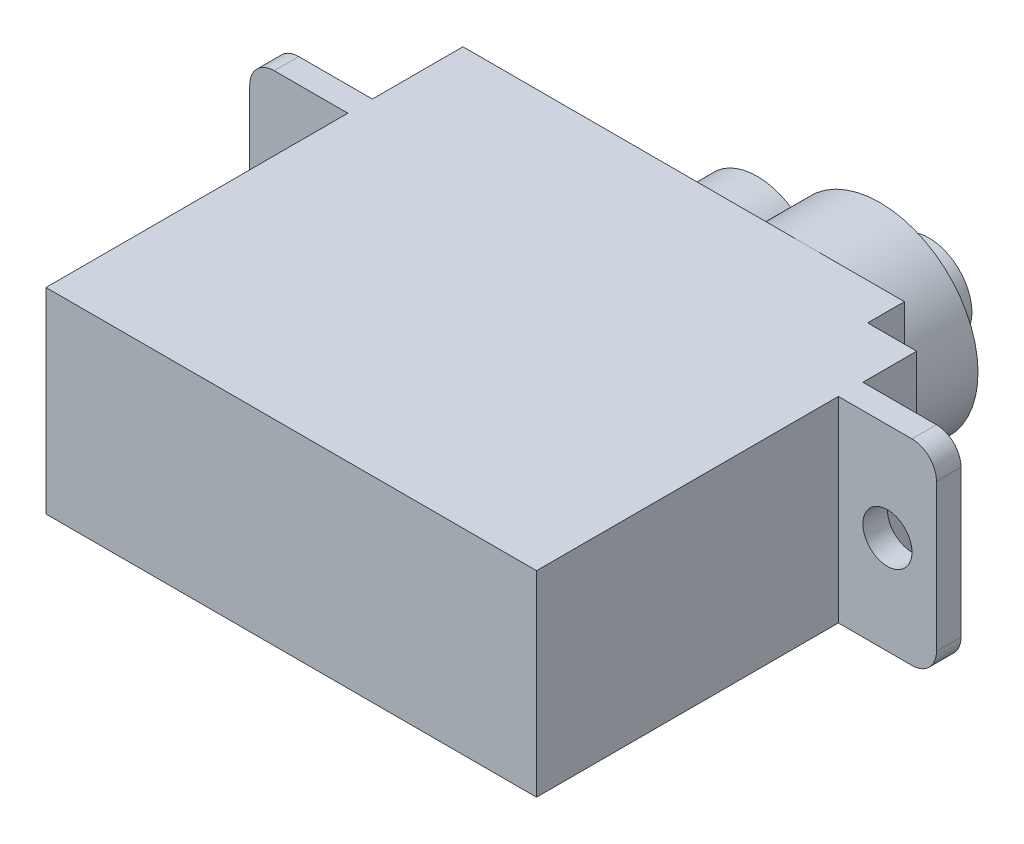
ISO-10303-21;
HEADER;
FILE_DESCRIPTION(('STEP AP214'),'2;1');
FILE_NAME('part.step','',(''),(''),'','','');
FILE_SCHEMA(('AUTOMOTIVE_DESIGN { 1 0 10303 214 1 1 1 1 }'));
ENDSEC;
DATA;
#1=APPLICATION_CONTEXT('core data for automotive mechanical design processes');
#2=APPLICATION_PROTOCOL_DEFINITION('international standard','automotive_design',2000,#1);
#3=PRODUCT_CONTEXT('',#1,'mechanical');
#4=PRODUCT('Part','Part','',(#3));
#5=PRODUCT_RELATED_PRODUCT_CATEGORY('part','',(#4));
#6=PRODUCT_DEFINITION_FORMATION('','',#4);
#7=PRODUCT_DEFINITION_CONTEXT('part definition',#1,'design');
#8=PRODUCT_DEFINITION('design','',#6,#7);
#9=PRODUCT_DEFINITION_SHAPE('','',#8);
#10=(LENGTH_UNIT() NAMED_UNIT(*) SI_UNIT(.MILLI.,.METRE.));
#11=(NAMED_UNIT(*) PLANE_ANGLE_UNIT() SI_UNIT($,.RADIAN.));
#12=(NAMED_UNIT(*) SI_UNIT($,.STERADIAN.) SOLID_ANGLE_UNIT());
#13=UNCERTAINTY_MEASURE_WITH_UNIT(LENGTH_MEASURE(1.E-05),#10,'distance_accuracy_value','');
#14=(GEOMETRIC_REPRESENTATION_CONTEXT(3) GLOBAL_UNCERTAINTY_ASSIGNED_CONTEXT((#13)) GLOBAL_UNIT_ASSIGNED_CONTEXT((#10,
#11,#12)) REPRESENTATION_CONTEXT('',''));
#15=CARTESIAN_POINT('',(0.,0.,0.));
#16=DIRECTION('',(0.,0.,1.));
#17=DIRECTION('',(1.,0.,0.));
#18=AXIS2_PLACEMENT_3D('',#15,#16,#17);
#19=CARTESIAN_POINT('',(5.95121951219512,4.,-8.801393728223));
#20=DIRECTION('',(0.,0.,1.));
#21=DIRECTION('',(1.,0.,0.));
#22=AXIS2_PLACEMENT_3D('',#19,#20,#21);
#23=CYLINDRICAL_SURFACE('',#22,4.);
#24=DIRECTION('',(0.,0.,1.));
#25=VECTOR('',#24,1.);
#26=CARTESIAN_POINT('',(2.50581216751059,1.96796451084291,-7.301393728223));
#27=LINE('',#26,#25);
#28=CARTESIAN_POINT('',(2.50581216751059,1.96796451084291,-8.801393728223));
#29=VERTEX_POINT('',#28);
#30=CARTESIAN_POINT('',(2.50581216751059,1.96796451084291,-5.801393728223));
#31=VERTEX_POINT('',#30);
#32=EDGE_CURVE('E229',#29,#31,#27,.T.);
#33=ORIENTED_EDGE('',*,*,#32,.F.);
#34=CARTESIAN_POINT('',(5.95121951219512,4.,-8.801393728223));
#35=DIRECTION('',(0.,0.,-1.));
#36=DIRECTION('',(-1.,0.,0.));
#37=AXIS2_PLACEMENT_3D('',#34,#35,#36);
#38=CIRCLE('',#37,4.);
#39=CARTESIAN_POINT('',(2.44705584221105,5.92894711538803,-8.801393728223));
#40=VERTEX_POINT('',#39);
#41=EDGE_CURVE('E240',#40,#29,#38,.T.);
#42=ORIENTED_EDGE('',*,*,#41,.F.);
#43=DIRECTION('',(0.,0.,1.));
#44=VECTOR('',#43,1.);
#45=CARTESIAN_POINT('',(2.44705584221105,5.92894711538803,-7.301393728223));
#46=LINE('',#45,#44);
#47=CARTESIAN_POINT('',(2.44705584221105,5.92894711538803,-5.801393728223));
#48=VERTEX_POINT('',#47);
#49=EDGE_CURVE('E232',#48,#40,#46,.F.);
#50=ORIENTED_EDGE('',*,*,#49,.F.);
#51=CARTESIAN_POINT('',(5.95121951219512,4.,-5.801393728223));
#52=DIRECTION('',(0.,0.,-1.));
#53=DIRECTION('',(-1.,0.,0.));
#54=AXIS2_PLACEMENT_3D('',#51,#52,#53);
#55=CIRCLE('',#54,4.);
#56=CARTESIAN_POINT('',(5.95121951219512,8.,-5.801393728223));
#57=VERTEX_POINT('',#56);
#58=EDGE_CURVE('E253',#48,#57,#55,.T.);
#59=ORIENTED_EDGE('',*,*,#58,.T.);
#60=CARTESIAN_POINT('',(9.95121951219512,4.,-5.801393728223));
#61=VERTEX_POINT('',#60);
#62=EDGE_CURVE('E243',#57,#61,#55,.T.);
#63=ORIENTED_EDGE('',*,*,#62,.T.);
#64=CARTESIAN_POINT('',(5.95121951219512,0.,-5.801393728223));
#65=VERTEX_POINT('',#64);
#66=EDGE_CURVE('E357',#61,#65,#55,.T.);
#67=ORIENTED_EDGE('',*,*,#66,.T.);
#68=EDGE_CURVE('E242',#65,#31,#55,.T.);
#69=ORIENTED_EDGE('',*,*,#68,.T.);
#70=EDGE_LOOP('',(#33,#42,#50,#59,#63,#67,#69));
#71=FACE_BOUND('',#70,.T.);
#72=ADVANCED_FACE('F78',(#71),#23,.T.);
#73=CARTESIAN_POINT('',(0.,8.,-5.801393728223));
#74=DIRECTION('',(0.,0.,1.));
#75=DIRECTION('',(1.,0.,0.));
#76=AXIS2_PLACEMENT_3D('',#73,#74,#75);
#77=PLANE('',#76);
#78=ORIENTED_EDGE('',*,*,#62,.F.);
#79=DIRECTION('',(-1.,0.,0.));
#80=VECTOR('',#79,1.);
#81=CARTESIAN_POINT('',(0.,8.,-5.801393728223));
#82=LINE('',#81,#80);
#83=CARTESIAN_POINT('',(9.95121951219512,8.,-5.801393728223));
#84=VERTEX_POINT('',#83);
#85=EDGE_CURVE('E261',#84,#57,#82,.T.);
#86=ORIENTED_EDGE('',*,*,#85,.F.);
#87=DIRECTION('',(0.,-1.,0.));
#88=VECTOR('',#87,1.);
#89=CARTESIAN_POINT('',(9.95121951219512,8.,-5.801393728223));
#90=LINE('',#89,#88);
#91=EDGE_CURVE('E330',#84,#61,#90,.T.);
#92=ORIENTED_EDGE('',*,*,#91,.T.);
#93=EDGE_LOOP('',(#78,#86,#92));
#94=FACE_BOUND('',#93,.T.);
#95=ADVANCED_FACE('F408',(#94),#77,.F.);
#96=ORIENTED_EDGE('',*,*,#66,.F.);
#97=CARTESIAN_POINT('',(9.95121951219512,0.,-5.801393728223));
#98=VERTEX_POINT('',#97);
#99=EDGE_CURVE('E329',#61,#98,#90,.T.);
#100=ORIENTED_EDGE('',*,*,#99,.T.);
#101=DIRECTION('',(-1.,0.,0.));
#102=VECTOR('',#101,1.);
#103=CARTESIAN_POINT('',(0.,0.,-5.801393728223));
#104=LINE('',#103,#102);
#105=EDGE_CURVE('E287',#98,#65,#104,.T.);
#106=ORIENTED_EDGE('',*,*,#105,.T.);
#107=EDGE_LOOP('',(#96,#100,#106));
#108=FACE_BOUND('',#107,.T.);
#109=ADVANCED_FACE('F413',(#108),#77,.F.);
#110=CARTESIAN_POINT('',(0.,8.,-4.301393728223));
#111=DIRECTION('',(0.,0.,1.));
#112=DIRECTION('',(1.,0.,0.));
#113=AXIS2_PLACEMENT_3D('',#110,#111,#112);
#114=PLANE('',#113);
#115=DIRECTION('',(-1.,0.,0.));
#116=VECTOR('',#115,1.);
#117=CARTESIAN_POINT('',(0.,0.,-4.301393728223));
#118=LINE('',#117,#116);
#119=CARTESIAN_POINT('',(11.9512195121951,0.,-4.301393728223));
#120=VERTEX_POINT('',#119);
#121=CARTESIAN_POINT('',(9.95121951219512,0.,-4.301393728223));
#122=VERTEX_POINT('',#121);
#123=EDGE_CURVE('E260',#120,#122,#118,.T.);
#124=ORIENTED_EDGE('',*,*,#123,.T.);
#125=DIRECTION('',(0.,-1.,0.));
#126=VECTOR('',#125,1.);
#127=CARTESIAN_POINT('',(9.95121951219512,8.,-4.301393728223));
#128=LINE('',#127,#126);
#129=CARTESIAN_POINT('',(9.95121951219512,8.,-4.301393728223));
#130=VERTEX_POINT('',#129);
#131=EDGE_CURVE('E281',#130,#122,#128,.T.);
#132=ORIENTED_EDGE('',*,*,#131,.F.);
#133=DIRECTION('',(-1.,0.,0.));
#134=VECTOR('',#133,1.);
#135=CARTESIAN_POINT('',(0.,8.,-4.301393728223));
#136=LINE('',#135,#134);
#137=CARTESIAN_POINT('',(11.9512195121951,8.,-4.301393728223));
#138=VERTEX_POINT('',#137);
#139=EDGE_CURVE('E279',#138,#130,#136,.T.);
#140=ORIENTED_EDGE('',*,*,#139,.F.);
#141=DIRECTION('',(0.,-1.,0.));
#142=VECTOR('',#141,1.);
#143=CARTESIAN_POINT('',(11.9512195121951,8.,-4.301393728223));
#144=LINE('',#143,#142);
#145=EDGE_CURVE('E308',#138,#120,#144,.T.);
#146=ORIENTED_EDGE('',*,*,#145,.T.);
#147=EDGE_LOOP('',(#124,#132,#140,#146));
#148=FACE_BOUND('',#147,.T.);
#149=ADVANCED_FACE('F428',(#148),#114,.F.);
#150=CARTESIAN_POINT('',(11.9512195121951,8.,0.));
#151=DIRECTION('',(-1.,0.,0.));
#152=DIRECTION('',(0.,0.,1.));
#153=AXIS2_PLACEMENT_3D('',#150,#151,#152);
#154=PLANE('',#153);
#155=DIRECTION('',(0.,0.,-1.));
#156=VECTOR('',#155,1.);
#157=CARTESIAN_POINT('',(11.9512195121951,0.,0.));
#158=LINE('',#157,#156);
#159=CARTESIAN_POINT('',(11.9512195121951,0.,-2.10801393728223));
#160=VERTEX_POINT('',#159);
#161=EDGE_CURVE('E300',#160,#120,#158,.T.);
#162=ORIENTED_EDGE('',*,*,#161,.T.);
#163=ORIENTED_EDGE('',*,*,#145,.F.);
#164=DIRECTION('',(0.,0.,-1.));
#165=VECTOR('',#164,1.);
#166=CARTESIAN_POINT('',(11.9512195121951,8.,0.));
#167=LINE('',#166,#165);
#168=CARTESIAN_POINT('',(11.9512195121951,8.,-2.10801393728223));
#169=VERTEX_POINT('',#168);
#170=EDGE_CURVE('E274',#169,#138,#167,.T.);
#171=ORIENTED_EDGE('',*,*,#170,.F.);
#172=DIRECTION('',(0.,-1.,0.));
#173=VECTOR('',#172,1.);
#174=CARTESIAN_POINT('',(11.9512195121951,8.,-2.10801393728223));
#175=LINE('',#174,#173);
#176=EDGE_CURVE('E311',#169,#160,#175,.T.);
#177=ORIENTED_EDGE('',*,*,#176,.T.);
#178=EDGE_LOOP('',(#162,#163,#171,#177));
#179=FACE_BOUND('',#178,.T.);
#180=ADVANCED_FACE('F431',(#179),#154,.F.);
#181=CARTESIAN_POINT('',(0.,8.,-2.10801393728222));
#182=DIRECTION('',(0.,0.,-1.));
#183=DIRECTION('',(-1.,0.,0.));
#184=AXIS2_PLACEMENT_3D('',#181,#182,#183);
#185=PLANE('',#184);
#186=CARTESIAN_POINT('',(13.9512195121951,4.,-2.10801393728223));
#187=DIRECTION('',(0.,0.,-1.));
#188=DIRECTION('',(-1.,0.,0.));
#189=AXIS2_PLACEMENT_3D('',#186,#187,#188);
#190=CIRCLE('',#189,1.);
#191=CARTESIAN_POINT('',(12.9512195121951,4.,-2.10801393728223));
#192=VERTEX_POINT('',#191);
#193=EDGE_CURVE('E530',#192,#192,#190,.T.);
#194=ORIENTED_EDGE('',*,*,#193,.F.);
#195=EDGE_LOOP('',(#194));
#196=FACE_BOUND('',#195,.T.);
#197=DIRECTION('',(0.,-1.,0.));
#198=VECTOR('',#197,1.);
#199=CARTESIAN_POINT('',(15.9512195121951,8.,-2.10801393728223));
#200=LINE('',#199,#198);
#201=CARTESIAN_POINT('',(15.9512195121951,7.,-2.10801393728223));
#202=VERTEX_POINT('',#201);
#203=CARTESIAN_POINT('',(15.9512195121951,1.,-2.10801393728223));
#204=VERTEX_POINT('',#203);
#205=EDGE_CURVE('E313',#202,#204,#200,.T.);
#206=ORIENTED_EDGE('',*,*,#205,.T.);
#207=CARTESIAN_POINT('',(14.9512195121951,1.,-2.10801393728223));
#208=DIRECTION('',(0.,0.,-1.));
#209=DIRECTION('',(-1.,0.,0.));
#210=AXIS2_PLACEMENT_3D('',#207,#208,#209);
#211=CIRCLE('',#210,1.);
#212=CARTESIAN_POINT('',(14.9512195121951,0.,-2.10801393728223));
#213=VERTEX_POINT('',#212);
#214=EDGE_CURVE('E82',#204,#213,#211,.T.);
#215=ORIENTED_EDGE('',*,*,#214,.T.);
#216=DIRECTION('',(1.,0.,0.));
#217=VECTOR('',#216,1.);
#218=CARTESIAN_POINT('',(0.,0.,-2.10801393728222));
#219=LINE('',#218,#217);
#220=EDGE_CURVE('E302',#160,#213,#219,.T.);
#221=ORIENTED_EDGE('',*,*,#220,.F.);
#222=ORIENTED_EDGE('',*,*,#176,.F.);
#223=DIRECTION('',(1.,0.,0.));
#224=VECTOR('',#223,1.);
#225=CARTESIAN_POINT('',(0.,8.,-2.10801393728222));
#226=LINE('',#225,#224);
#227=CARTESIAN_POINT('',(14.9512195121951,8.,-2.10801393728223));
#228=VERTEX_POINT('',#227);
#229=EDGE_CURVE('E276',#169,#228,#226,.T.);
#230=ORIENTED_EDGE('',*,*,#229,.T.);
#231=CARTESIAN_POINT('',(14.9512195121951,7.,-2.10801393728223));
#232=DIRECTION('',(0.,0.,-1.));
#233=DIRECTION('',(-1.,0.,0.));
#234=AXIS2_PLACEMENT_3D('',#231,#232,#233);
#235=CIRCLE('',#234,1.);
#236=EDGE_CURVE('E361',#228,#202,#235,.T.);
#237=ORIENTED_EDGE('',*,*,#236,.T.);
#238=EDGE_LOOP('',(#206,#215,#221,#222,#230,#237));
#239=FACE_BOUND('',#238,.T.);
#240=ADVANCED_FACE('F387',(#196,#239),#185,.T.);
#241=CARTESIAN_POINT('',(15.9512195121951,8.,0.));
#242=DIRECTION('',(1.,0.,0.));
#243=DIRECTION('',(0.,0.,-1.));
#244=AXIS2_PLACEMENT_3D('',#241,#242,#243);
#245=PLANE('',#244);
#246=DIRECTION('',(0.,-1.,0.));
#247=VECTOR('',#246,1.);
#248=CARTESIAN_POINT('',(15.9512195121951,8.,-1.10801393728223));
#249=LINE('',#248,#247);
#250=CARTESIAN_POINT('',(15.9512195121951,7.,-1.10801393728223));
#251=VERTEX_POINT('',#250);
#252=CARTESIAN_POINT('',(15.9512195121951,1.,-1.10801393728223));
#253=VERTEX_POINT('',#252);
#254=EDGE_CURVE('E315',#251,#253,#249,.T.);
#255=ORIENTED_EDGE('',*,*,#254,.T.);
#256=DIRECTION('',(0.,0.,1.));
#257=VECTOR('',#256,1.);
#258=CARTESIAN_POINT('',(15.9512195121951,1.,-2.10801393728223));
#259=LINE('',#258,#257);
#260=EDGE_CURVE('E94',#253,#204,#259,.F.);
#261=ORIENTED_EDGE('',*,*,#260,.T.);
#262=ORIENTED_EDGE('',*,*,#205,.F.);
#263=DIRECTION('',(0.,0.,1.));
#264=VECTOR('',#263,1.);
#265=CARTESIAN_POINT('',(15.9512195121951,7.,0.));
#266=LINE('',#265,#264);
#267=EDGE_CURVE('E353',#202,#251,#266,.T.);
#268=ORIENTED_EDGE('',*,*,#267,.T.);
#269=EDGE_LOOP('',(#255,#261,#262,#268));
#270=FACE_BOUND('',#269,.T.);
#271=ADVANCED_FACE('F439',(#270),#245,.T.);
#272=CARTESIAN_POINT('',(0.,8.,-1.10801393728223));
#273=DIRECTION('',(0.,0.,1.));
#274=DIRECTION('',(1.,0.,0.));
#275=AXIS2_PLACEMENT_3D('',#272,#273,#274);
#276=PLANE('',#275);
#277=CARTESIAN_POINT('',(13.9512195121951,4.,-1.10801393728223));
#278=DIRECTION('',(0.,0.,1.));
#279=DIRECTION('',(1.,0.,0.));
#280=AXIS2_PLACEMENT_3D('',#277,#278,#279);
#281=CIRCLE('',#280,1.);
#282=CARTESIAN_POINT('',(14.9512195121951,4.,-1.10801393728223));
#283=VERTEX_POINT('',#282);
#284=EDGE_CURVE('E349',#283,#283,#281,.T.);
#285=ORIENTED_EDGE('',*,*,#284,.F.);
#286=EDGE_LOOP('',(#285));
#287=FACE_BOUND('',#286,.T.);
#288=DIRECTION('',(-1.,0.,0.));
#289=VECTOR('',#288,1.);
#290=CARTESIAN_POINT('',(0.,0.,-1.10801393728223));
#291=LINE('',#290,#289);
#292=CARTESIAN_POINT('',(14.9512195121951,0.,-1.10801393728223));
#293=VERTEX_POINT('',#292);
#294=CARTESIAN_POINT('',(11.9512195121951,0.,-1.10801393728223));
#295=VERTEX_POINT('',#294);
#296=EDGE_CURVE('E299',#293,#295,#291,.T.);
#297=ORIENTED_EDGE('',*,*,#296,.F.);
#298=CARTESIAN_POINT('',(14.9512195121951,1.,-1.10801393728223));
#299=DIRECTION('',(0.,0.,1.));
#300=DIRECTION('',(1.,0.,0.));
#301=AXIS2_PLACEMENT_3D('',#298,#299,#300);
#302=CIRCLE('',#301,1.);
#303=EDGE_CURVE('E102',#293,#253,#302,.T.);
#304=ORIENTED_EDGE('',*,*,#303,.T.);
#305=ORIENTED_EDGE('',*,*,#254,.F.);
#306=CARTESIAN_POINT('',(14.9512195121951,7.,-1.10801393728223));
#307=DIRECTION('',(0.,0.,1.));
#308=DIRECTION('',(1.,0.,0.));
#309=AXIS2_PLACEMENT_3D('',#306,#307,#308);
#310=CIRCLE('',#309,1.);
#311=CARTESIAN_POINT('',(14.9512195121951,8.,-1.10801393728223));
#312=VERTEX_POINT('',#311);
#313=EDGE_CURVE('E356',#251,#312,#310,.T.);
#314=ORIENTED_EDGE('',*,*,#313,.T.);
#315=DIRECTION('',(-1.,0.,0.));
#316=VECTOR('',#315,1.);
#317=CARTESIAN_POINT('',(0.,8.,-1.10801393728223));
#318=LINE('',#317,#316);
#319=CARTESIAN_POINT('',(11.9512195121951,8.,-1.10801393728223));
#320=VERTEX_POINT('',#319);
#321=EDGE_CURVE('E273',#312,#320,#318,.T.);
#322=ORIENTED_EDGE('',*,*,#321,.T.);
#323=DIRECTION('',(0.,-1.,0.));
#324=VECTOR('',#323,1.);
#325=CARTESIAN_POINT('',(11.9512195121951,8.,-1.10801393728223));
#326=LINE('',#325,#324);
#327=EDGE_CURVE('E317',#320,#295,#326,.T.);
#328=ORIENTED_EDGE('',*,*,#327,.T.);
#329=EDGE_LOOP('',(#297,#304,#305,#314,#322,#328));
#330=FACE_BOUND('',#329,.T.);
#331=ADVANCED_FACE('F443',(#287,#330),#276,.T.);
#332=CARTESIAN_POINT('',(11.9512195121951,0.,11.198606271777));
#333=VERTEX_POINT('',#332);
#334=EDGE_CURVE('E296',#333,#295,#158,.T.);
#335=ORIENTED_EDGE('',*,*,#334,.T.);
#336=ORIENTED_EDGE('',*,*,#327,.F.);
#337=CARTESIAN_POINT('',(11.9512195121951,8.,11.198606271777));
#338=VERTEX_POINT('',#337);
#339=EDGE_CURVE('E270',#338,#320,#167,.T.);
#340=ORIENTED_EDGE('',*,*,#339,.F.);
#341=DIRECTION('',(0.,-1.,0.));
#342=VECTOR('',#341,1.);
#343=CARTESIAN_POINT('',(11.9512195121951,8.,11.198606271777));
#344=LINE('',#343,#342);
#345=EDGE_CURVE('E320',#338,#333,#344,.T.);
#346=ORIENTED_EDGE('',*,*,#345,.T.);
#347=EDGE_LOOP('',(#335,#336,#340,#346));
#348=FACE_BOUND('',#347,.T.);
#349=ADVANCED_FACE('F436',(#348),#154,.F.);
#350=CARTESIAN_POINT('',(9.95121951219512,8.,0.));
#351=DIRECTION('',(-1.,0.,0.));
#352=DIRECTION('',(0.,0.,1.));
#353=AXIS2_PLACEMENT_3D('',#350,#351,#352);
#354=PLANE('',#353);
#355=DIRECTION('',(0.,0.,-1.));
#356=VECTOR('',#355,1.);
#357=CARTESIAN_POINT('',(9.95121951219512,0.,0.));
#358=LINE('',#357,#356);
#359=EDGE_CURVE('E282',#122,#98,#358,.T.);
#360=ORIENTED_EDGE('',*,*,#359,.T.);
#361=ORIENTED_EDGE('',*,*,#99,.F.);
#362=ORIENTED_EDGE('',*,*,#91,.F.);
#363=DIRECTION('',(0.,0.,-1.));
#364=VECTOR('',#363,1.);
#365=CARTESIAN_POINT('',(9.95121951219512,8.,0.));
#366=LINE('',#365,#364);
#367=EDGE_CURVE('E256',#130,#84,#366,.T.);
#368=ORIENTED_EDGE('',*,*,#367,.F.);
#369=ORIENTED_EDGE('',*,*,#131,.T.);
#370=EDGE_LOOP('',(#360,#361,#362,#368,#369));
#371=FACE_BOUND('',#370,.T.);
#372=ADVANCED_FACE('F455',(#371),#354,.F.);
#373=CARTESIAN_POINT('',(0.951219512195122,3.92583112428704,-5.801393728223));
#374=DIRECTION('',(0.,0.,-1.));
#375=DIRECTION('',(-1.,0.,0.));
#376=AXIS2_PLACEMENT_3D('',#373,#374,#375);
#377=CIRCLE('',#376,2.5);
#378=EDGE_CURVE('E236',#31,#48,#377,.T.);
#379=ORIENTED_EDGE('',*,*,#378,.F.);
#380=ORIENTED_EDGE('',*,*,#68,.F.);
#381=CARTESIAN_POINT('',(-8.04878048780488,0.,-5.801393728223));
#382=VERTEX_POINT('',#381);
#383=EDGE_CURVE('E285',#65,#382,#104,.T.);
#384=ORIENTED_EDGE('',*,*,#383,.T.);
#385=DIRECTION('',(0.,-1.,0.));
#386=VECTOR('',#385,1.);
#387=CARTESIAN_POINT('',(-8.04878048780488,8.,-5.801393728223));
#388=LINE('',#387,#386);
#389=CARTESIAN_POINT('',(-8.04878048780488,8.,-5.801393728223));
#390=VERTEX_POINT('',#389);
#391=EDGE_CURVE('E326',#390,#382,#388,.T.);
#392=ORIENTED_EDGE('',*,*,#391,.F.);
#393=EDGE_CURVE('E259',#57,#390,#82,.T.);
#394=ORIENTED_EDGE('',*,*,#393,.F.);
#395=ORIENTED_EDGE('',*,*,#58,.F.);
#396=EDGE_LOOP('',(#379,#380,#384,#392,#394,#395));
#397=FACE_BOUND('',#396,.T.);
#398=ADVANCED_FACE('F416',(#397),#77,.F.);
#399=CARTESIAN_POINT('',(0.,8.,11.198606271777));
#400=DIRECTION('',(0.,0.,-1.));
#401=DIRECTION('',(-1.,0.,0.));
#402=AXIS2_PLACEMENT_3D('',#399,#400,#401);
#403=PLANE('',#402);
#404=DIRECTION('',(1.,0.,0.));
#405=VECTOR('',#404,1.);
#406=CARTESIAN_POINT('',(0.,0.,11.198606271777));
#407=LINE('',#406,#405);
#408=CARTESIAN_POINT('',(-8.04878048780488,0.,11.198606271777));
#409=VERTEX_POINT('',#408);
#410=EDGE_CURVE('E294',#409,#333,#407,.T.);
#411=ORIENTED_EDGE('',*,*,#410,.T.);
#412=ORIENTED_EDGE('',*,*,#345,.F.);
#413=DIRECTION('',(1.,0.,0.));
#414=VECTOR('',#413,1.);
#415=CARTESIAN_POINT('',(0.,8.,11.198606271777));
#416=LINE('',#415,#414);
#417=CARTESIAN_POINT('',(-8.04878048780488,8.,11.198606271777));
#418=VERTEX_POINT('',#417);
#419=EDGE_CURVE('E268',#418,#338,#416,.T.);
#420=ORIENTED_EDGE('',*,*,#419,.F.);
#421=DIRECTION('',(0.,-1.,0.));
#422=VECTOR('',#421,1.);
#423=CARTESIAN_POINT('',(-8.04878048780488,8.,11.198606271777));
#424=LINE('',#423,#422);
#425=EDGE_CURVE('E323',#418,#409,#424,.T.);
#426=ORIENTED_EDGE('',*,*,#425,.T.);
#427=EDGE_LOOP('',(#411,#412,#420,#426));
#428=FACE_BOUND('',#427,.T.);
#429=ADVANCED_FACE('F427',(#428),#403,.F.);
#430=CARTESIAN_POINT('',(0.,0.,0.));
#431=DIRECTION('',(0.,1.,0.));
#432=DIRECTION('',(0.,0.,1.));
#433=AXIS2_PLACEMENT_3D('',#430,#431,#432);
#434=PLANE('',#433);
#435=DIRECTION('',(1.,0.,0.));
#436=VECTOR('',#435,1.);
#437=CARTESIAN_POINT('',(-12.0487804878049,0.,-1.10801393728223));
#438=LINE('',#437,#436);
#439=CARTESIAN_POINT('',(-11.0487804878049,0.,-1.10801393728223));
#440=VERTEX_POINT('',#439);
#441=CARTESIAN_POINT('',(-8.04878048780488,0.,-1.10801393728223));
#442=VERTEX_POINT('',#441);
#443=EDGE_CURVE('E249',#440,#442,#438,.T.);
#444=ORIENTED_EDGE('',*,*,#443,.F.);
#445=DIRECTION('',(0.,0.,1.));
#446=VECTOR('',#445,1.);
#447=CARTESIAN_POINT('',(-11.0487804878049,0.,0.));
#448=LINE('',#447,#446);
#449=CARTESIAN_POINT('',(-11.0487804878049,0.,-2.10801393728223));
#450=VERTEX_POINT('',#449);
#451=EDGE_CURVE('E375',#440,#450,#448,.F.);
#452=ORIENTED_EDGE('',*,*,#451,.T.);
#453=DIRECTION('',(-1.,0.,0.));
#454=VECTOR('',#453,1.);
#455=CARTESIAN_POINT('',(-8.04878048780488,0.,-2.10801393728223));
#456=LINE('',#455,#454);
#457=CARTESIAN_POINT('',(-8.04878048780488,0.,-2.10801393728223));
#458=VERTEX_POINT('',#457);
#459=EDGE_CURVE('E246',#458,#450,#456,.T.);
#460=ORIENTED_EDGE('',*,*,#459,.F.);
#461=DIRECTION('',(0.,0.,1.));
#462=VECTOR('',#461,1.);
#463=CARTESIAN_POINT('',(-8.04878048780488,0.,0.));
#464=LINE('',#463,#462);
#465=EDGE_CURVE('E291',#382,#458,#464,.T.);
#466=ORIENTED_EDGE('',*,*,#465,.F.);
#467=ORIENTED_EDGE('',*,*,#383,.F.);
#468=ORIENTED_EDGE('',*,*,#105,.F.);
#469=ORIENTED_EDGE('',*,*,#359,.F.);
#470=ORIENTED_EDGE('',*,*,#123,.F.);
#471=ORIENTED_EDGE('',*,*,#161,.F.);
#472=ORIENTED_EDGE('',*,*,#220,.T.);
#473=DIRECTION('',(0.,0.,1.));
#474=VECTOR('',#473,1.);
#475=CARTESIAN_POINT('',(14.9512195121951,0.,-1.10801393728223));
#476=LINE('',#475,#474);
#477=EDGE_CURVE('E372',#213,#293,#476,.T.);
#478=ORIENTED_EDGE('',*,*,#477,.T.);
#479=ORIENTED_EDGE('',*,*,#296,.T.);
#480=ORIENTED_EDGE('',*,*,#334,.F.);
#481=ORIENTED_EDGE('',*,*,#410,.F.);
#482=EDGE_CURVE('E290',#442,#409,#464,.T.);
#483=ORIENTED_EDGE('',*,*,#482,.F.);
#484=EDGE_LOOP('',(#444,#452,#460,#466,#467,#468,#469,#470,#471,#472,#478,#479,#480,#481,#483));
#485=FACE_BOUND('',#484,.T.);
#486=ADVANCED_FACE('F393',(#485),#434,.F.);
#487=CARTESIAN_POINT('',(0.,8.,0.));
#488=DIRECTION('',(0.,1.,0.));
#489=DIRECTION('',(0.,0.,1.));
#490=AXIS2_PLACEMENT_3D('',#487,#488,#489);
#491=PLANE('',#490);
#492=DIRECTION('',(-1.,0.,0.));
#493=VECTOR('',#492,1.);
#494=CARTESIAN_POINT('',(-8.04878048780488,8.,-2.10801393728223));
#495=LINE('',#494,#493);
#496=CARTESIAN_POINT('',(-8.04878048780488,8.,-2.10801393728223));
#497=VERTEX_POINT('',#496);
#498=CARTESIAN_POINT('',(-11.0487804878049,8.,-2.10801393728223));
#499=VERTEX_POINT('',#498);
#500=EDGE_CURVE('E334',#497,#499,#495,.T.);
#501=ORIENTED_EDGE('',*,*,#500,.T.);
#502=DIRECTION('',(0.,0.,1.));
#503=VECTOR('',#502,1.);
#504=CARTESIAN_POINT('',(-11.0487804878049,8.,-1.10801393728223));
#505=LINE('',#504,#503);
#506=CARTESIAN_POINT('',(-11.0487804878049,8.,-1.10801393728223));
#507=VERTEX_POINT('',#506);
#508=EDGE_CURVE('E381',#499,#507,#505,.T.);
#509=ORIENTED_EDGE('',*,*,#508,.T.);
#510=DIRECTION('',(1.,0.,0.));
#511=VECTOR('',#510,1.);
#512=CARTESIAN_POINT('',(-12.0487804878049,8.,-1.10801393728223));
#513=LINE('',#512,#511);
#514=CARTESIAN_POINT('',(-8.04878048780488,8.,-1.10801393728223));
#515=VERTEX_POINT('',#514);
#516=EDGE_CURVE('E337',#507,#515,#513,.T.);
#517=ORIENTED_EDGE('',*,*,#516,.T.);
#518=DIRECTION('',(0.,0.,1.));
#519=VECTOR('',#518,1.);
#520=CARTESIAN_POINT('',(-8.04878048780488,8.,0.));
#521=LINE('',#520,#519);
#522=EDGE_CURVE('E264',#515,#418,#521,.T.);
#523=ORIENTED_EDGE('',*,*,#522,.T.);
#524=ORIENTED_EDGE('',*,*,#419,.T.);
#525=ORIENTED_EDGE('',*,*,#339,.T.);
#526=ORIENTED_EDGE('',*,*,#321,.F.);
#527=DIRECTION('',(0.,0.,1.));
#528=VECTOR('',#527,1.);
#529=CARTESIAN_POINT('',(14.9512195121951,8.,0.));
#530=LINE('',#529,#528);
#531=EDGE_CURVE('E359',#312,#228,#530,.F.);
#532=ORIENTED_EDGE('',*,*,#531,.T.);
#533=ORIENTED_EDGE('',*,*,#229,.F.);
#534=ORIENTED_EDGE('',*,*,#170,.T.);
#535=ORIENTED_EDGE('',*,*,#139,.T.);
#536=ORIENTED_EDGE('',*,*,#367,.T.);
#537=ORIENTED_EDGE('',*,*,#85,.T.);
#538=ORIENTED_EDGE('',*,*,#393,.T.);
#539=EDGE_CURVE('E265',#390,#497,#521,.T.);
#540=ORIENTED_EDGE('',*,*,#539,.T.);
#541=EDGE_LOOP('',(#501,#509,#517,#523,#524,#525,#526,#532,#533,#534,#535,#536,#537,#538,#540));
#542=FACE_BOUND('',#541,.T.);
#543=ADVANCED_FACE('F420',(#542),#491,.T.);
#544=CARTESIAN_POINT('',(-8.04878048780488,8.,0.));
#545=DIRECTION('',(1.,0.,0.));
#546=DIRECTION('',(0.,0.,-1.));
#547=AXIS2_PLACEMENT_3D('',#544,#545,#546);
#548=PLANE('',#547);
#549=ORIENTED_EDGE('',*,*,#522,.F.);
#550=DIRECTION('',(0.,-1.,0.));
#551=VECTOR('',#550,1.);
#552=CARTESIAN_POINT('',(-8.04878048780488,8.,-1.10801393728223));
#553=LINE('',#552,#551);
#554=EDGE_CURVE('E333',#515,#442,#553,.T.);
#555=ORIENTED_EDGE('',*,*,#554,.T.);
#556=ORIENTED_EDGE('',*,*,#482,.T.);
#557=ORIENTED_EDGE('',*,*,#425,.F.);
#558=EDGE_LOOP('',(#549,#555,#556,#557));
#559=FACE_BOUND('',#558,.T.);
#560=ADVANCED_FACE('F423',(#559),#548,.F.);
#561=DIRECTION('',(0.,-1.,0.));
#562=VECTOR('',#561,1.);
#563=CARTESIAN_POINT('',(-8.04878048780488,8.,-2.10801393728223));
#564=LINE('',#563,#562);
#565=EDGE_CURVE('E343',#497,#458,#564,.T.);
#566=ORIENTED_EDGE('',*,*,#565,.F.);
#567=ORIENTED_EDGE('',*,*,#539,.F.);
#568=ORIENTED_EDGE('',*,*,#391,.T.);
#569=ORIENTED_EDGE('',*,*,#465,.T.);
#570=EDGE_LOOP('',(#566,#567,#568,#569));
#571=FACE_BOUND('',#570,.T.);
#572=ADVANCED_FACE('F451',(#571),#548,.F.);
#573=CARTESIAN_POINT('',(-12.0487804878049,8.,-2.10801393728223));
#574=DIRECTION('',(1.,0.,0.));
#575=DIRECTION('',(0.,0.,-1.));
#576=AXIS2_PLACEMENT_3D('',#573,#574,#575);
#577=PLANE('',#576);
#578=DIRECTION('',(0.,-1.,0.));
#579=VECTOR('',#578,1.);
#580=CARTESIAN_POINT('',(-12.0487804878049,8.,-2.10801393728223));
#581=LINE('',#580,#579);
#582=CARTESIAN_POINT('',(-12.0487804878049,7.,-2.10801393728223));
#583=VERTEX_POINT('',#582);
#584=CARTESIAN_POINT('',(-12.0487804878049,1.,-2.10801393728223));
#585=VERTEX_POINT('',#584);
#586=EDGE_CURVE('E286',#583,#585,#581,.T.);
#587=ORIENTED_EDGE('',*,*,#586,.T.);
#588=DIRECTION('',(0.,0.,1.));
#589=VECTOR('',#588,1.);
#590=CARTESIAN_POINT('',(-12.0487804878049,1.,-2.10801393728223));
#591=LINE('',#590,#589);
#592=CARTESIAN_POINT('',(-12.0487804878049,1.,-1.10801393728223));
#593=VERTEX_POINT('',#592);
#594=EDGE_CURVE('E365',#585,#593,#591,.T.);
#595=ORIENTED_EDGE('',*,*,#594,.T.);
#596=DIRECTION('',(0.,-1.,0.));
#597=VECTOR('',#596,1.);
#598=CARTESIAN_POINT('',(-12.0487804878049,8.,-1.10801393728223));
#599=LINE('',#598,#597);
#600=CARTESIAN_POINT('',(-12.0487804878049,7.,-1.10801393728223));
#601=VERTEX_POINT('',#600);
#602=EDGE_CURVE('E338',#601,#593,#599,.T.);
#603=ORIENTED_EDGE('',*,*,#602,.F.);
#604=DIRECTION('',(0.,0.,1.));
#605=VECTOR('',#604,1.);
#606=CARTESIAN_POINT('',(-12.0487804878049,7.,-2.10801393728223));
#607=LINE('',#606,#605);
#608=EDGE_CURVE('E363',#601,#583,#607,.F.);
#609=ORIENTED_EDGE('',*,*,#608,.T.);
#610=EDGE_LOOP('',(#587,#595,#603,#609));
#611=FACE_BOUND('',#610,.T.);
#612=ADVANCED_FACE('F464',(#611),#577,.F.);
#613=CARTESIAN_POINT('',(-12.0487804878049,8.,-1.10801393728223));
#614=DIRECTION('',(0.,0.,-1.));
#615=DIRECTION('',(-1.,0.,0.));
#616=AXIS2_PLACEMENT_3D('',#613,#614,#615);
#617=PLANE('',#616);
#618=CARTESIAN_POINT('',(-10.0487804878049,4.,-1.10801393728223));
#619=DIRECTION('',(0.,0.,-1.));
#620=DIRECTION('',(-1.,0.,0.));
#621=AXIS2_PLACEMENT_3D('',#618,#619,#620);
#622=CIRCLE('',#621,1.);
#623=CARTESIAN_POINT('',(-11.0487804878049,4.,-1.10801393728223));
#624=VERTEX_POINT('',#623);
#625=EDGE_CURVE('E352',#624,#624,#622,.T.);
#626=ORIENTED_EDGE('',*,*,#625,.T.);
#627=EDGE_LOOP('',(#626));
#628=FACE_BOUND('',#627,.T.);
#629=ORIENTED_EDGE('',*,*,#602,.T.);
#630=CARTESIAN_POINT('',(-11.0487804878049,1.,-1.10801393728223));
#631=DIRECTION('',(0.,0.,-1.));
#632=DIRECTION('',(-1.,0.,0.));
#633=AXIS2_PLACEMENT_3D('',#630,#631,#632);
#634=CIRCLE('',#633,1.);
#635=EDGE_CURVE('E370',#593,#440,#634,.F.);
#636=ORIENTED_EDGE('',*,*,#635,.T.);
#637=ORIENTED_EDGE('',*,*,#443,.T.);
#638=ORIENTED_EDGE('',*,*,#554,.F.);
#639=ORIENTED_EDGE('',*,*,#516,.F.);
#640=CARTESIAN_POINT('',(-11.0487804878049,7.,-1.10801393728223));
#641=DIRECTION('',(0.,0.,-1.));
#642=DIRECTION('',(-1.,0.,0.));
#643=AXIS2_PLACEMENT_3D('',#640,#641,#642);
#644=CIRCLE('',#643,1.);
#645=EDGE_CURVE('E368',#507,#601,#644,.F.);
#646=ORIENTED_EDGE('',*,*,#645,.T.);
#647=EDGE_LOOP('',(#629,#636,#637,#638,#639,#646));
#648=FACE_BOUND('',#647,.T.);
#649=ADVANCED_FACE('F460',(#628,#648),#617,.F.);
#650=CARTESIAN_POINT('',(-8.04878048780488,8.,-2.10801393728223));
#651=DIRECTION('',(0.,0.,1.));
#652=DIRECTION('',(1.,0.,0.));
#653=AXIS2_PLACEMENT_3D('',#650,#651,#652);
#654=PLANE('',#653);
#655=CARTESIAN_POINT('',(-10.0487804878049,4.,-2.10801393728222));
#656=DIRECTION('',(0.,0.,-1.));
#657=DIRECTION('',(-1.,0.,0.));
#658=AXIS2_PLACEMENT_3D('',#655,#656,#657);
#659=CIRCLE('',#658,1.);
#660=CARTESIAN_POINT('',(-11.0487804878049,4.,-2.10801393728221));
#661=VERTEX_POINT('',#660);
#662=EDGE_CURVE('E531',#661,#661,#659,.T.);
#663=ORIENTED_EDGE('',*,*,#662,.F.);
#664=EDGE_LOOP('',(#663));
#665=FACE_BOUND('',#664,.T.);
#666=ORIENTED_EDGE('',*,*,#459,.T.);
#667=CARTESIAN_POINT('',(-11.0487804878049,1.,-2.10801393728223));
#668=DIRECTION('',(0.,0.,1.));
#669=DIRECTION('',(1.,0.,0.));
#670=AXIS2_PLACEMENT_3D('',#667,#668,#669);
#671=CIRCLE('',#670,1.);
#672=EDGE_CURVE('E379',#450,#585,#671,.F.);
#673=ORIENTED_EDGE('',*,*,#672,.T.);
#674=ORIENTED_EDGE('',*,*,#586,.F.);
#675=CARTESIAN_POINT('',(-11.0487804878049,7.,-2.10801393728223));
#676=DIRECTION('',(0.,0.,1.));
#677=DIRECTION('',(1.,0.,0.));
#678=AXIS2_PLACEMENT_3D('',#675,#676,#677);
#679=CIRCLE('',#678,1.);
#680=EDGE_CURVE('E377',#583,#499,#679,.F.);
#681=ORIENTED_EDGE('',*,*,#680,.T.);
#682=ORIENTED_EDGE('',*,*,#500,.F.);
#683=ORIENTED_EDGE('',*,*,#565,.T.);
#684=EDGE_LOOP('',(#666,#673,#674,#681,#682,#683));
#685=FACE_BOUND('',#684,.T.);
#686=ADVANCED_FACE('F463',(#665,#685),#654,.F.);
#687=CARTESIAN_POINT('',(5.95121951219512,4.,-8.801393728223));
#688=DIRECTION('',(0.,0.,-1.));
#689=DIRECTION('',(-1.,0.,0.));
#690=AXIS2_PLACEMENT_3D('',#687,#688,#689);
#691=PLANE('',#690);
#692=CARTESIAN_POINT('',(5.95121951219512,4.,-8.801393728223));
#693=DIRECTION('',(0.,0.,-1.));
#694=DIRECTION('',(-1.,0.,0.));
#695=AXIS2_PLACEMENT_3D('',#692,#693,#694);
#696=CIRCLE('',#695,1.75);
#697=CARTESIAN_POINT('',(4.20121951219512,4.,-8.801393728223));
#698=VERTEX_POINT('',#697);
#699=EDGE_CURVE('E12',#698,#698,#696,.T.);
#700=ORIENTED_EDGE('',*,*,#699,.F.);
#701=EDGE_LOOP('',(#700));
#702=FACE_BOUND('',#701,.T.);
#703=ORIENTED_EDGE('',*,*,#41,.T.);
#704=CARTESIAN_POINT('',(0.951219512195121,3.92583112428704,-8.801393728223));
#705=DIRECTION('',(0.,0.,-1.));
#706=DIRECTION('',(-1.,0.,0.));
#707=AXIS2_PLACEMENT_3D('',#704,#705,#706);
#708=CIRCLE('',#707,2.5);
#709=EDGE_CURVE('E226',#29,#40,#708,.T.);
#710=ORIENTED_EDGE('',*,*,#709,.T.);
#711=EDGE_LOOP('',(#703,#710));
#712=FACE_BOUND('',#711,.T.);
#713=ADVANCED_FACE('F245',(#702,#712),#691,.T.);
#714=CARTESIAN_POINT('',(0.951219512195121,3.92583112428704,-8.801393728223));
#715=DIRECTION('',(0.,0.,1.));
#716=DIRECTION('',(1.,0.,0.));
#717=AXIS2_PLACEMENT_3D('',#714,#715,#716);
#718=CYLINDRICAL_SURFACE('',#717,2.5);
#719=ORIENTED_EDGE('',*,*,#709,.F.);
#720=ORIENTED_EDGE('',*,*,#32,.T.);
#721=ORIENTED_EDGE('',*,*,#378,.T.);
#722=ORIENTED_EDGE('',*,*,#49,.T.);
#723=EDGE_LOOP('',(#719,#720,#721,#722));
#724=FACE_BOUND('',#723,.T.);
#725=ADVANCED_FACE('F228',(#724),#718,.T.);
#726=CARTESIAN_POINT('',(-10.0487804878049,4.,11.198606271777));
#727=DIRECTION('',(0.,0.,-1.));
#728=DIRECTION('',(-1.,0.,0.));
#729=AXIS2_PLACEMENT_3D('',#726,#727,#728);
#730=CYLINDRICAL_SURFACE('',#729,1.);
#731=ORIENTED_EDGE('',*,*,#662,.T.);
#732=EDGE_LOOP('',(#731));
#733=FACE_BOUND('',#732,.T.);
#734=ORIENTED_EDGE('',*,*,#625,.F.);
#735=EDGE_LOOP('',(#734));
#736=FACE_BOUND('',#735,.T.);
#737=ADVANCED_FACE('F547',(#733,#736),#730,.F.);
#738=CARTESIAN_POINT('',(13.9512195121951,4.,11.198606271777));
#739=DIRECTION('',(0.,0.,-1.));
#740=DIRECTION('',(-1.,0.,0.));
#741=AXIS2_PLACEMENT_3D('',#738,#739,#740);
#742=CYLINDRICAL_SURFACE('',#741,1.);
#743=ORIENTED_EDGE('',*,*,#284,.T.);
#744=EDGE_LOOP('',(#743));
#745=FACE_BOUND('',#744,.T.);
#746=ORIENTED_EDGE('',*,*,#193,.T.);
#747=EDGE_LOOP('',(#746));
#748=FACE_BOUND('',#747,.T.);
#749=ADVANCED_FACE('F475',(#745,#748),#742,.F.);
#750=CARTESIAN_POINT('',(14.9512195121951,7.,0.));
#751=DIRECTION('',(0.,0.,1.));
#752=DIRECTION('',(1.,0.,0.));
#753=AXIS2_PLACEMENT_3D('',#750,#751,#752);
#754=CYLINDRICAL_SURFACE('',#753,1.);
#755=ORIENTED_EDGE('',*,*,#236,.F.);
#756=ORIENTED_EDGE('',*,*,#531,.F.);
#757=ORIENTED_EDGE('',*,*,#313,.F.);
#758=ORIENTED_EDGE('',*,*,#267,.F.);
#759=EDGE_LOOP('',(#755,#756,#757,#758));
#760=FACE_BOUND('',#759,.T.);
#761=ADVANCED_FACE('F472',(#760),#754,.T.);
#762=CARTESIAN_POINT('',(-11.0487804878049,1.,-2.10801393728223));
#763=DIRECTION('',(0.,0.,1.));
#764=DIRECTION('',(1.,0.,0.));
#765=AXIS2_PLACEMENT_3D('',#762,#763,#764);
#766=CYLINDRICAL_SURFACE('',#765,1.);
#767=ORIENTED_EDGE('',*,*,#672,.F.);
#768=ORIENTED_EDGE('',*,*,#451,.F.);
#769=ORIENTED_EDGE('',*,*,#635,.F.);
#770=ORIENTED_EDGE('',*,*,#594,.F.);
#771=EDGE_LOOP('',(#767,#768,#769,#770));
#772=FACE_BOUND('',#771,.T.);
#773=ADVANCED_FACE('F405',(#772),#766,.T.);
#774=CARTESIAN_POINT('',(-11.0487804878049,7.,0.));
#775=DIRECTION('',(0.,0.,-1.));
#776=DIRECTION('',(-1.,0.,0.));
#777=AXIS2_PLACEMENT_3D('',#774,#775,#776);
#778=CYLINDRICAL_SURFACE('',#777,1.);
#779=ORIENTED_EDGE('',*,*,#680,.F.);
#780=ORIENTED_EDGE('',*,*,#608,.F.);
#781=ORIENTED_EDGE('',*,*,#645,.F.);
#782=ORIENTED_EDGE('',*,*,#508,.F.);
#783=EDGE_LOOP('',(#779,#780,#781,#782));
#784=FACE_BOUND('',#783,.T.);
#785=ADVANCED_FACE('F397',(#784),#778,.T.);
#786=CARTESIAN_POINT('',(14.9512195121951,1.,0.));
#787=DIRECTION('',(0.,0.,-1.));
#788=DIRECTION('',(-1.,0.,0.));
#789=AXIS2_PLACEMENT_3D('',#786,#787,#788);
#790=CYLINDRICAL_SURFACE('',#789,1.);
#791=ORIENTED_EDGE('',*,*,#214,.F.);
#792=ORIENTED_EDGE('',*,*,#260,.F.);
#793=ORIENTED_EDGE('',*,*,#303,.F.);
#794=ORIENTED_EDGE('',*,*,#477,.F.);
#795=EDGE_LOOP('',(#791,#792,#793,#794));
#796=FACE_BOUND('',#795,.T.);
#797=ADVANCED_FACE('F80',(#796),#790,.T.);
#798=CARTESIAN_POINT('',(5.95121951219512,4.,-10.801393728223));
#799=DIRECTION('',(0.,0.,1.));
#800=DIRECTION('',(1.,0.,0.));
#801=AXIS2_PLACEMENT_3D('',#798,#799,#800);
#802=CYLINDRICAL_SURFACE('',#801,1.75);
#803=CARTESIAN_POINT('',(5.95121951219512,4.,-10.801393728223));
#804=DIRECTION('',(0.,0.,-1.));
#805=DIRECTION('',(-1.,0.,0.));
#806=AXIS2_PLACEMENT_3D('',#803,#804,#805);
#807=CIRCLE('',#806,1.75);
#808=CARTESIAN_POINT('',(4.20121951219512,4.,-10.801393728223));
#809=VERTEX_POINT('',#808);
#810=EDGE_CURVE('E534',#809,#809,#807,.T.);
#811=ORIENTED_EDGE('',*,*,#810,.F.);
#812=EDGE_LOOP('',(#811));
#813=FACE_BOUND('',#812,.T.);
#814=ORIENTED_EDGE('',*,*,#699,.T.);
#815=EDGE_LOOP('',(#814));
#816=FACE_BOUND('',#815,.T.);
#817=ADVANCED_FACE('F396',(#813,#816),#802,.T.);
#818=CARTESIAN_POINT('',(5.95121951219512,4.,-10.801393728223));
#819=DIRECTION('',(0.,0.,-1.));
#820=DIRECTION('',(-1.,0.,0.));
#821=AXIS2_PLACEMENT_3D('',#818,#819,#820);
#822=PLANE('',#821);
#823=ORIENTED_EDGE('',*,*,#810,.T.);
#824=EDGE_LOOP('',(#823));
#825=FACE_BOUND('',#824,.T.);
#826=ADVANCED_FACE('F402',(#825),#822,.T.);
#827=CLOSED_SHELL('',(#72,#95,#109,#149,#180,#240,#271,#331,#349,#372,#398,#429,#486,#543,#560,
#572,#612,#649,#686,#713,#725,#737,#749,#761,#773,#785,#797,#817,#826));
#828=MANIFOLD_SOLID_BREP('B2',#827);
#829=ADVANCED_BREP_SHAPE_REPRESENTATION('',(#18,#828),#14);
#830=SHAPE_DEFINITION_REPRESENTATION(#9,#829);
ENDSEC;
END-ISO-10303-21;
